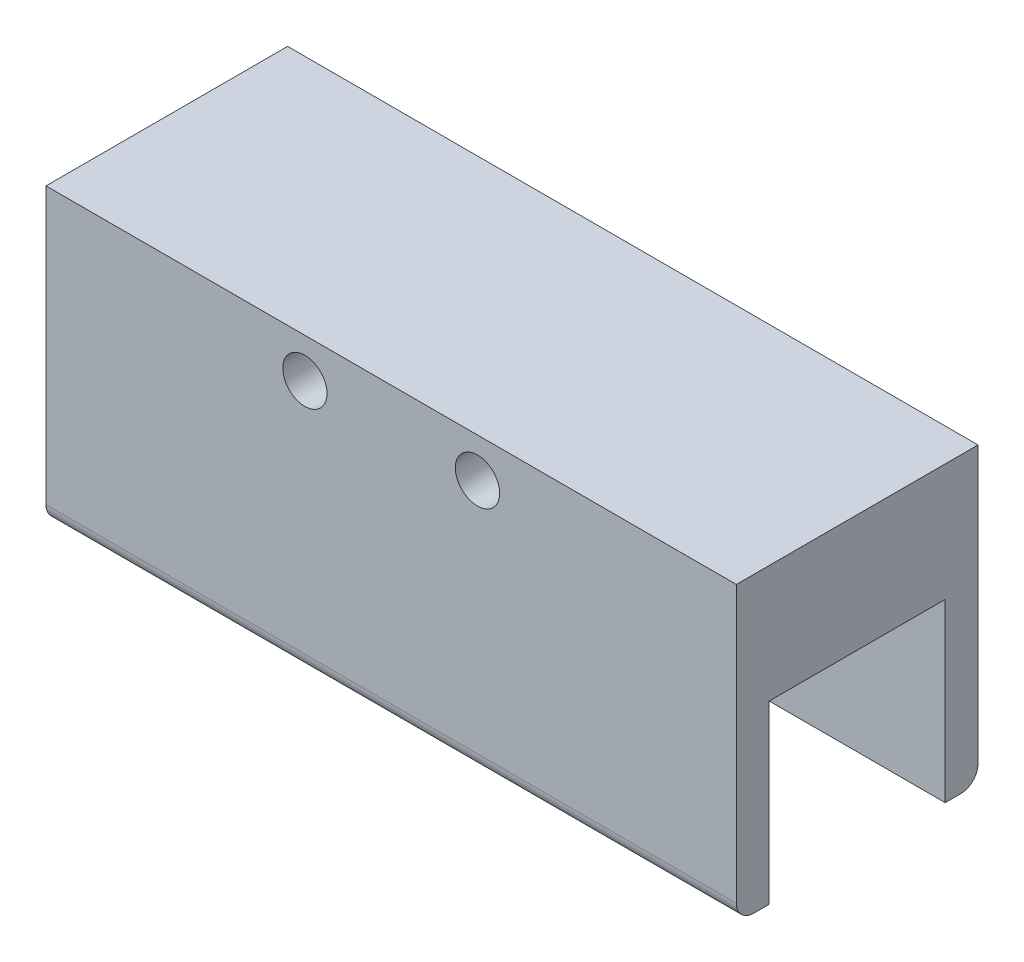
ISO-10303-21;
HEADER;
FILE_DESCRIPTION(('STEP AP214'),'2;1');
FILE_NAME('part.step','',(''),(''),'','','');
FILE_SCHEMA(('AUTOMOTIVE_DESIGN { 1 0 10303 214 1 1 1 1 }'));
ENDSEC;
DATA;
#1=APPLICATION_CONTEXT('core data for automotive mechanical design processes');
#2=APPLICATION_PROTOCOL_DEFINITION('international standard','automotive_design',2000,#1);
#3=PRODUCT_CONTEXT('',#1,'mechanical');
#4=PRODUCT('Part','Part','',(#3));
#5=PRODUCT_RELATED_PRODUCT_CATEGORY('part','',(#4));
#6=PRODUCT_DEFINITION_FORMATION('','',#4);
#7=PRODUCT_DEFINITION_CONTEXT('part definition',#1,'design');
#8=PRODUCT_DEFINITION('design','',#6,#7);
#9=PRODUCT_DEFINITION_SHAPE('','',#8);
#10=(LENGTH_UNIT() NAMED_UNIT(*) SI_UNIT(.MILLI.,.METRE.));
#11=(NAMED_UNIT(*) PLANE_ANGLE_UNIT() SI_UNIT($,.RADIAN.));
#12=(NAMED_UNIT(*) SI_UNIT($,.STERADIAN.) SOLID_ANGLE_UNIT());
#13=UNCERTAINTY_MEASURE_WITH_UNIT(LENGTH_MEASURE(1.E-05),#10,'distance_accuracy_value','');
#14=(GEOMETRIC_REPRESENTATION_CONTEXT(3) GLOBAL_UNCERTAINTY_ASSIGNED_CONTEXT((#13)) GLOBAL_UNIT_ASSIGNED_CONTEXT((#10,
#11,#12)) REPRESENTATION_CONTEXT('',''));
#15=CARTESIAN_POINT('',(0.,0.,0.));
#16=DIRECTION('',(0.,0.,1.));
#17=DIRECTION('',(1.,0.,0.));
#18=AXIS2_PLACEMENT_3D('',#15,#16,#17);
#19=CARTESIAN_POINT('',(0.,0.,70.));
#20=DIRECTION('',(1.,0.,0.));
#21=DIRECTION('',(0.,0.,-1.));
#22=AXIS2_PLACEMENT_3D('',#19,#20,#21);
#23=PLANE('',#22);
#24=DIRECTION('',(0.,-1.,0.));
#25=VECTOR('',#24,1.);
#26=CARTESIAN_POINT('',(0.,0.,0.));
#27=LINE('',#26,#25);
#28=CARTESIAN_POINT('',(0.,85.,0.));
#29=VERTEX_POINT('',#28);
#30=CARTESIAN_POINT('',(0.,5.,0.));
#31=VERTEX_POINT('',#30);
#32=EDGE_CURVE('E172',#29,#31,#27,.T.);
#33=ORIENTED_EDGE('',*,*,#32,.T.);
#34=CARTESIAN_POINT('',(0.,5.,5.));
#35=DIRECTION('',(1.,0.,0.));
#36=DIRECTION('',(0.,0.,-1.));
#37=AXIS2_PLACEMENT_3D('',#34,#35,#36);
#38=CIRCLE('',#37,5.);
#39=CARTESIAN_POINT('',(0.,0.,5.));
#40=VERTEX_POINT('',#39);
#41=EDGE_CURVE('E135',#31,#40,#38,.F.);
#42=ORIENTED_EDGE('',*,*,#41,.T.);
#43=DIRECTION('',(0.,0.,-1.));
#44=VECTOR('',#43,1.);
#45=CARTESIAN_POINT('',(0.,0.,70.));
#46=LINE('',#45,#44);
#47=CARTESIAN_POINT('',(0.,0.,9.50000000000003));
#48=VERTEX_POINT('',#47);
#49=EDGE_CURVE('E127',#48,#40,#46,.T.);
#50=ORIENTED_EDGE('',*,*,#49,.F.);
#51=DIRECTION('',(0.,1.,0.));
#52=VECTOR('',#51,1.);
#53=CARTESIAN_POINT('',(0.,0.,9.50000000000003));
#54=LINE('',#53,#52);
#55=CARTESIAN_POINT('',(0.,51.,9.50000000000003));
#56=VERTEX_POINT('',#55);
#57=EDGE_CURVE('E110',#48,#56,#54,.T.);
#58=ORIENTED_EDGE('',*,*,#57,.T.);
#59=DIRECTION('',(0.,0.,-1.));
#60=VECTOR('',#59,1.);
#61=CARTESIAN_POINT('',(0.,51.,0.));
#62=LINE('',#61,#60);
#63=CARTESIAN_POINT('',(0.,51.,60.5));
#64=VERTEX_POINT('',#63);
#65=EDGE_CURVE('E119',#64,#56,#62,.T.);
#66=ORIENTED_EDGE('',*,*,#65,.F.);
#67=DIRECTION('',(0.,1.,0.));
#68=VECTOR('',#67,1.);
#69=CARTESIAN_POINT('',(0.,0.,60.5));
#70=LINE('',#69,#68);
#71=CARTESIAN_POINT('',(0.,0.,60.5));
#72=VERTEX_POINT('',#71);
#73=EDGE_CURVE('E131',#72,#64,#70,.T.);
#74=ORIENTED_EDGE('',*,*,#73,.F.);
#75=CARTESIAN_POINT('',(0.,0.,65.));
#76=VERTEX_POINT('',#75);
#77=EDGE_CURVE('E136',#76,#72,#46,.T.);
#78=ORIENTED_EDGE('',*,*,#77,.F.);
#79=CARTESIAN_POINT('',(0.,5.,65.));
#80=DIRECTION('',(1.,0.,0.));
#81=DIRECTION('',(0.,0.,-1.));
#82=AXIS2_PLACEMENT_3D('',#79,#80,#81);
#83=CIRCLE('',#82,5.);
#84=CARTESIAN_POINT('',(0.,5.,70.));
#85=VERTEX_POINT('',#84);
#86=EDGE_CURVE('E48',#76,#85,#83,.F.);
#87=ORIENTED_EDGE('',*,*,#86,.T.);
#88=DIRECTION('',(0.,-1.,0.));
#89=VECTOR('',#88,1.);
#90=CARTESIAN_POINT('',(0.,0.,70.));
#91=LINE('',#90,#89);
#92=CARTESIAN_POINT('',(0.,85.,70.));
#93=VERTEX_POINT('',#92);
#94=EDGE_CURVE('E158',#93,#85,#91,.T.);
#95=ORIENTED_EDGE('',*,*,#94,.F.);
#96=DIRECTION('',(0.,0.,-1.));
#97=VECTOR('',#96,1.);
#98=CARTESIAN_POINT('',(0.,85.,70.));
#99=LINE('',#98,#97);
#100=EDGE_CURVE('E167',#93,#29,#99,.T.);
#101=ORIENTED_EDGE('',*,*,#100,.T.);
#102=EDGE_LOOP('',(#33,#42,#50,#58,#66,#74,#78,#87,#95,#101));
#103=FACE_BOUND('',#102,.T.);
#104=ADVANCED_FACE('F33',(#103),#23,.F.);
#105=CARTESIAN_POINT('',(0.,0.,70.));
#106=DIRECTION('',(0.,1.,0.));
#107=DIRECTION('',(0.,0.,1.));
#108=AXIS2_PLACEMENT_3D('',#105,#106,#107);
#109=PLANE('',#108);
#110=DIRECTION('',(0.,0.,-1.));
#111=VECTOR('',#110,1.);
#112=CARTESIAN_POINT('',(200.,0.,70.));
#113=LINE('',#112,#111);
#114=CARTESIAN_POINT('',(200.,0.,65.));
#115=VERTEX_POINT('',#114);
#116=CARTESIAN_POINT('',(200.,0.,60.5));
#117=VERTEX_POINT('',#116);
#118=EDGE_CURVE('E137',#115,#117,#113,.T.);
#119=ORIENTED_EDGE('',*,*,#118,.F.);
#120=DIRECTION('',(1.,0.,0.));
#121=VECTOR('',#120,1.);
#122=CARTESIAN_POINT('',(0.,0.,65.));
#123=LINE('',#122,#121);
#124=EDGE_CURVE('E11',#115,#76,#123,.F.);
#125=ORIENTED_EDGE('',*,*,#124,.T.);
#126=ORIENTED_EDGE('',*,*,#77,.T.);
#127=DIRECTION('',(1.,0.,0.));
#128=VECTOR('',#127,1.);
#129=CARTESIAN_POINT('',(0.,0.,60.5));
#130=LINE('',#129,#128);
#131=EDGE_CURVE('E175',#72,#117,#130,.T.);
#132=ORIENTED_EDGE('',*,*,#131,.T.);
#133=EDGE_LOOP('',(#119,#125,#126,#132));
#134=FACE_BOUND('',#133,.T.);
#135=ADVANCED_FACE('F238',(#134),#109,.F.);
#136=CARTESIAN_POINT('',(200.,0.,70.));
#137=DIRECTION('',(-1.,0.,0.));
#138=DIRECTION('',(0.,0.,1.));
#139=AXIS2_PLACEMENT_3D('',#136,#137,#138);
#140=PLANE('',#139);
#141=CARTESIAN_POINT('',(200.,0.,9.50000000000003));
#142=VERTEX_POINT('',#141);
#143=CARTESIAN_POINT('',(200.,0.,5.));
#144=VERTEX_POINT('',#143);
#145=EDGE_CURVE('E130',#142,#144,#113,.T.);
#146=ORIENTED_EDGE('',*,*,#145,.T.);
#147=CARTESIAN_POINT('',(200.,5.,5.));
#148=DIRECTION('',(-1.,0.,0.));
#149=DIRECTION('',(0.,0.,1.));
#150=AXIS2_PLACEMENT_3D('',#147,#148,#149);
#151=CIRCLE('',#150,5.);
#152=CARTESIAN_POINT('',(200.,5.,0.));
#153=VERTEX_POINT('',#152);
#154=EDGE_CURVE('E146',#144,#153,#151,.F.);
#155=ORIENTED_EDGE('',*,*,#154,.T.);
#156=DIRECTION('',(0.,1.,0.));
#157=VECTOR('',#156,1.);
#158=CARTESIAN_POINT('',(200.,0.,0.));
#159=LINE('',#158,#157);
#160=CARTESIAN_POINT('',(200.,85.,0.));
#161=VERTEX_POINT('',#160);
#162=EDGE_CURVE('E174',#153,#161,#159,.T.);
#163=ORIENTED_EDGE('',*,*,#162,.T.);
#164=DIRECTION('',(0.,0.,-1.));
#165=VECTOR('',#164,1.);
#166=CARTESIAN_POINT('',(200.,85.,70.));
#167=LINE('',#166,#165);
#168=CARTESIAN_POINT('',(200.,85.,70.));
#169=VERTEX_POINT('',#168);
#170=EDGE_CURVE('E163',#169,#161,#167,.T.);
#171=ORIENTED_EDGE('',*,*,#170,.F.);
#172=DIRECTION('',(0.,1.,0.));
#173=VECTOR('',#172,1.);
#174=CARTESIAN_POINT('',(200.,0.,70.));
#175=LINE('',#174,#173);
#176=CARTESIAN_POINT('',(200.,5.,70.));
#177=VERTEX_POINT('',#176);
#178=EDGE_CURVE('E156',#177,#169,#175,.T.);
#179=ORIENTED_EDGE('',*,*,#178,.F.);
#180=CARTESIAN_POINT('',(200.,5.,65.));
#181=DIRECTION('',(-1.,0.,0.));
#182=DIRECTION('',(0.,0.,1.));
#183=AXIS2_PLACEMENT_3D('',#180,#181,#182);
#184=CIRCLE('',#183,5.);
#185=EDGE_CURVE('E144',#177,#115,#184,.F.);
#186=ORIENTED_EDGE('',*,*,#185,.T.);
#187=ORIENTED_EDGE('',*,*,#118,.T.);
#188=DIRECTION('',(0.,1.,0.));
#189=VECTOR('',#188,1.);
#190=CARTESIAN_POINT('',(200.,0.,60.5));
#191=LINE('',#190,#189);
#192=CARTESIAN_POINT('',(200.,51.,60.5));
#193=VERTEX_POINT('',#192);
#194=EDGE_CURVE('E120',#117,#193,#191,.T.);
#195=ORIENTED_EDGE('',*,*,#194,.T.);
#196=DIRECTION('',(0.,0.,-1.));
#197=VECTOR('',#196,1.);
#198=CARTESIAN_POINT('',(200.,51.,0.));
#199=LINE('',#198,#197);
#200=CARTESIAN_POINT('',(200.,51.,9.50000000000003));
#201=VERTEX_POINT('',#200);
#202=EDGE_CURVE('E186',#193,#201,#199,.T.);
#203=ORIENTED_EDGE('',*,*,#202,.T.);
#204=DIRECTION('',(0.,1.,0.));
#205=VECTOR('',#204,1.);
#206=CARTESIAN_POINT('',(200.,0.,9.50000000000003));
#207=LINE('',#206,#205);
#208=EDGE_CURVE('E183',#142,#201,#207,.T.);
#209=ORIENTED_EDGE('',*,*,#208,.F.);
#210=EDGE_LOOP('',(#146,#155,#163,#171,#179,#186,#187,#195,#203,#209));
#211=FACE_BOUND('',#210,.T.);
#212=ADVANCED_FACE('F161',(#211),#140,.F.);
#213=ORIENTED_EDGE('',*,*,#49,.T.);
#214=DIRECTION('',(1.,0.,0.));
#215=VECTOR('',#214,1.);
#216=CARTESIAN_POINT('',(200.,0.,5.));
#217=LINE('',#216,#215);
#218=EDGE_CURVE('E139',#40,#144,#217,.T.);
#219=ORIENTED_EDGE('',*,*,#218,.T.);
#220=ORIENTED_EDGE('',*,*,#145,.F.);
#221=DIRECTION('',(1.,0.,0.));
#222=VECTOR('',#221,1.);
#223=CARTESIAN_POINT('',(0.,0.,9.50000000000003));
#224=LINE('',#223,#222);
#225=EDGE_CURVE('E114',#48,#142,#224,.T.);
#226=ORIENTED_EDGE('',*,*,#225,.F.);
#227=EDGE_LOOP('',(#213,#219,#220,#226));
#228=FACE_BOUND('',#227,.T.);
#229=ADVANCED_FACE('F125',(#228),#109,.F.);
#230=CARTESIAN_POINT('',(0.,85.,70.));
#231=DIRECTION('',(0.,-1.,0.));
#232=DIRECTION('',(0.,0.,-1.));
#233=AXIS2_PLACEMENT_3D('',#230,#231,#232);
#234=PLANE('',#233);
#235=DIRECTION('',(-1.,0.,0.));
#236=VECTOR('',#235,1.);
#237=CARTESIAN_POINT('',(0.,85.,0.));
#238=LINE('',#237,#236);
#239=EDGE_CURVE('E169',#161,#29,#238,.T.);
#240=ORIENTED_EDGE('',*,*,#239,.T.);
#241=ORIENTED_EDGE('',*,*,#100,.F.);
#242=DIRECTION('',(-1.,0.,0.));
#243=VECTOR('',#242,1.);
#244=CARTESIAN_POINT('',(0.,85.,70.));
#245=LINE('',#244,#243);
#246=EDGE_CURVE('E165',#169,#93,#245,.T.);
#247=ORIENTED_EDGE('',*,*,#246,.F.);
#248=ORIENTED_EDGE('',*,*,#170,.T.);
#249=EDGE_LOOP('',(#240,#241,#247,#248));
#250=FACE_BOUND('',#249,.T.);
#251=ADVANCED_FACE('F220',(#250),#234,.F.);
#252=CARTESIAN_POINT('',(0.,0.,70.));
#253=DIRECTION('',(0.,0.,-1.));
#254=DIRECTION('',(-1.,0.,0.));
#255=AXIS2_PLACEMENT_3D('',#252,#253,#254);
#256=PLANE('',#255);
#257=CARTESIAN_POINT('',(125.,73.585,70.));
#258=DIRECTION('',(0.,0.,1.));
#259=DIRECTION('',(1.,0.,0.));
#260=AXIS2_PLACEMENT_3D('',#257,#258,#259);
#261=CIRCLE('',#260,6.41499999999999);
#262=CARTESIAN_POINT('',(131.415,73.585,70.));
#263=VERTEX_POINT('',#262);
#264=EDGE_CURVE('E191',#263,#263,#261,.T.);
#265=ORIENTED_EDGE('',*,*,#264,.F.);
#266=EDGE_LOOP('',(#265));
#267=FACE_BOUND('',#266,.T.);
#268=CARTESIAN_POINT('',(75.,73.585,70.));
#269=DIRECTION('',(0.,0.,1.));
#270=DIRECTION('',(-1.,0.,0.));
#271=AXIS2_PLACEMENT_3D('',#268,#269,#270);
#272=CIRCLE('',#271,6.41499999999999);
#273=CARTESIAN_POINT('',(68.585,73.585,70.));
#274=VERTEX_POINT('',#273);
#275=EDGE_CURVE('E206',#274,#274,#272,.T.);
#276=ORIENTED_EDGE('',*,*,#275,.F.);
#277=EDGE_LOOP('',(#276));
#278=FACE_BOUND('',#277,.T.);
#279=ORIENTED_EDGE('',*,*,#94,.T.);
#280=DIRECTION('',(1.,0.,0.));
#281=VECTOR('',#280,1.);
#282=CARTESIAN_POINT('',(0.,5.,70.));
#283=LINE('',#282,#281);
#284=EDGE_CURVE('E41',#85,#177,#283,.T.);
#285=ORIENTED_EDGE('',*,*,#284,.T.);
#286=ORIENTED_EDGE('',*,*,#178,.T.);
#287=ORIENTED_EDGE('',*,*,#246,.T.);
#288=EDGE_LOOP('',(#279,#285,#286,#287));
#289=FACE_BOUND('',#288,.T.);
#290=ADVANCED_FACE('F155',(#267,#278,#289),#256,.F.);
#291=CARTESIAN_POINT('',(0.,0.,0.));
#292=DIRECTION('',(0.,0.,-1.));
#293=DIRECTION('',(-1.,0.,0.));
#294=AXIS2_PLACEMENT_3D('',#291,#292,#293);
#295=PLANE('',#294);
#296=CARTESIAN_POINT('',(125.,73.585,0.));
#297=DIRECTION('',(0.,0.,1.));
#298=DIRECTION('',(1.,0.,0.));
#299=AXIS2_PLACEMENT_3D('',#296,#297,#298);
#300=CIRCLE('',#299,6.41499999999999);
#301=CARTESIAN_POINT('',(131.415,73.585,0.));
#302=VERTEX_POINT('',#301);
#303=EDGE_CURVE('E187',#302,#302,#300,.T.);
#304=ORIENTED_EDGE('',*,*,#303,.T.);
#305=EDGE_LOOP('',(#304));
#306=FACE_BOUND('',#305,.T.);
#307=CARTESIAN_POINT('',(75.,73.585,0.));
#308=DIRECTION('',(0.,0.,1.));
#309=DIRECTION('',(-1.,0.,0.));
#310=AXIS2_PLACEMENT_3D('',#307,#308,#309);
#311=CIRCLE('',#310,6.41499999999999);
#312=CARTESIAN_POINT('',(68.585,73.585,0.));
#313=VERTEX_POINT('',#312);
#314=EDGE_CURVE('E209',#313,#313,#311,.T.);
#315=ORIENTED_EDGE('',*,*,#314,.T.);
#316=EDGE_LOOP('',(#315));
#317=FACE_BOUND('',#316,.T.);
#318=ORIENTED_EDGE('',*,*,#162,.F.);
#319=DIRECTION('',(1.,0.,0.));
#320=VECTOR('',#319,1.);
#321=CARTESIAN_POINT('',(0.,5.,0.));
#322=LINE('',#321,#320);
#323=EDGE_CURVE('E148',#153,#31,#322,.F.);
#324=ORIENTED_EDGE('',*,*,#323,.T.);
#325=ORIENTED_EDGE('',*,*,#32,.F.);
#326=ORIENTED_EDGE('',*,*,#239,.F.);
#327=EDGE_LOOP('',(#318,#324,#325,#326));
#328=FACE_BOUND('',#327,.T.);
#329=ADVANCED_FACE('F219',(#306,#317,#328),#295,.T.);
#330=CARTESIAN_POINT('',(0.,0.,60.5));
#331=DIRECTION('',(0.,0.,-1.));
#332=DIRECTION('',(-1.,0.,0.));
#333=AXIS2_PLACEMENT_3D('',#330,#331,#332);
#334=PLANE('',#333);
#335=ORIENTED_EDGE('',*,*,#194,.F.);
#336=ORIENTED_EDGE('',*,*,#131,.F.);
#337=ORIENTED_EDGE('',*,*,#73,.T.);
#338=DIRECTION('',(1.,0.,0.));
#339=VECTOR('',#338,1.);
#340=CARTESIAN_POINT('',(0.,51.,60.5));
#341=LINE('',#340,#339);
#342=EDGE_CURVE('E199',#64,#193,#341,.T.);
#343=ORIENTED_EDGE('',*,*,#342,.T.);
#344=EDGE_LOOP('',(#335,#336,#337,#343));
#345=FACE_BOUND('',#344,.T.);
#346=ADVANCED_FACE('F297',(#345),#334,.T.);
#347=CARTESIAN_POINT('',(0.,51.,0.));
#348=DIRECTION('',(0.,-1.,0.));
#349=DIRECTION('',(0.,0.,-1.));
#350=AXIS2_PLACEMENT_3D('',#347,#348,#349);
#351=PLANE('',#350);
#352=ORIENTED_EDGE('',*,*,#202,.F.);
#353=ORIENTED_EDGE('',*,*,#342,.F.);
#354=ORIENTED_EDGE('',*,*,#65,.T.);
#355=DIRECTION('',(1.,0.,0.));
#356=VECTOR('',#355,1.);
#357=CARTESIAN_POINT('',(0.,51.,9.50000000000003));
#358=LINE('',#357,#356);
#359=EDGE_CURVE('E116',#56,#201,#358,.T.);
#360=ORIENTED_EDGE('',*,*,#359,.T.);
#361=EDGE_LOOP('',(#352,#353,#354,#360));
#362=FACE_BOUND('',#361,.T.);
#363=ADVANCED_FACE('F202',(#362),#351,.T.);
#364=CARTESIAN_POINT('',(0.,0.,9.50000000000003));
#365=DIRECTION('',(0.,0.,-1.));
#366=DIRECTION('',(-1.,0.,0.));
#367=AXIS2_PLACEMENT_3D('',#364,#365,#366);
#368=PLANE('',#367);
#369=ORIENTED_EDGE('',*,*,#208,.T.);
#370=ORIENTED_EDGE('',*,*,#359,.F.);
#371=ORIENTED_EDGE('',*,*,#57,.F.);
#372=ORIENTED_EDGE('',*,*,#225,.T.);
#373=EDGE_LOOP('',(#369,#370,#371,#372));
#374=FACE_BOUND('',#373,.T.);
#375=ADVANCED_FACE('F113',(#374),#368,.F.);
#376=CARTESIAN_POINT('',(0.,5.,5.));
#377=DIRECTION('',(-1.,0.,0.));
#378=DIRECTION('',(0.,0.,1.));
#379=AXIS2_PLACEMENT_3D('',#376,#377,#378);
#380=CYLINDRICAL_SURFACE('',#379,5.);
#381=ORIENTED_EDGE('',*,*,#41,.F.);
#382=ORIENTED_EDGE('',*,*,#323,.F.);
#383=ORIENTED_EDGE('',*,*,#154,.F.);
#384=ORIENTED_EDGE('',*,*,#218,.F.);
#385=EDGE_LOOP('',(#381,#382,#383,#384));
#386=FACE_BOUND('',#385,.T.);
#387=ADVANCED_FACE('F234',(#386),#380,.T.);
#388=CARTESIAN_POINT('',(0.,5.,65.));
#389=DIRECTION('',(1.,0.,0.));
#390=DIRECTION('',(0.,0.,-1.));
#391=AXIS2_PLACEMENT_3D('',#388,#389,#390);
#392=CYLINDRICAL_SURFACE('',#391,5.);
#393=ORIENTED_EDGE('',*,*,#86,.F.);
#394=ORIENTED_EDGE('',*,*,#124,.F.);
#395=ORIENTED_EDGE('',*,*,#185,.F.);
#396=ORIENTED_EDGE('',*,*,#284,.F.);
#397=EDGE_LOOP('',(#393,#394,#395,#396));
#398=FACE_BOUND('',#397,.T.);
#399=ADVANCED_FACE('F35',(#398),#392,.T.);
#400=CARTESIAN_POINT('',(75.,73.585,0.));
#401=DIRECTION('',(0.,0.,1.));
#402=DIRECTION('',(1.,0.,0.));
#403=AXIS2_PLACEMENT_3D('',#400,#401,#402);
#404=CYLINDRICAL_SURFACE('',#403,6.41499999999999);
#405=ORIENTED_EDGE('',*,*,#314,.F.);
#406=EDGE_LOOP('',(#405));
#407=FACE_BOUND('',#406,.T.);
#408=ORIENTED_EDGE('',*,*,#275,.T.);
#409=EDGE_LOOP('',(#408));
#410=FACE_BOUND('',#409,.T.);
#411=ADVANCED_FACE('F224',(#407,#410),#404,.F.);
#412=CARTESIAN_POINT('',(125.,73.585,0.));
#413=DIRECTION('',(0.,0.,1.));
#414=DIRECTION('',(1.,0.,0.));
#415=AXIS2_PLACEMENT_3D('',#412,#413,#414);
#416=CYLINDRICAL_SURFACE('',#415,6.41499999999999);
#417=ORIENTED_EDGE('',*,*,#303,.F.);
#418=EDGE_LOOP('',(#417));
#419=FACE_BOUND('',#418,.T.);
#420=ORIENTED_EDGE('',*,*,#264,.T.);
#421=EDGE_LOOP('',(#420));
#422=FACE_BOUND('',#421,.T.);
#423=ADVANCED_FACE('F215',(#419,#422),#416,.F.);
#424=CLOSED_SHELL('',(#104,#135,#212,#229,#251,#290,#329,#346,#363,#375,#387,#399,#411,#423));
#425=MANIFOLD_SOLID_BREP('B2',#424);
#426=ADVANCED_BREP_SHAPE_REPRESENTATION('',(#18,#425),#14);
#427=SHAPE_DEFINITION_REPRESENTATION(#9,#426);
ENDSEC;
END-ISO-10303-21;
